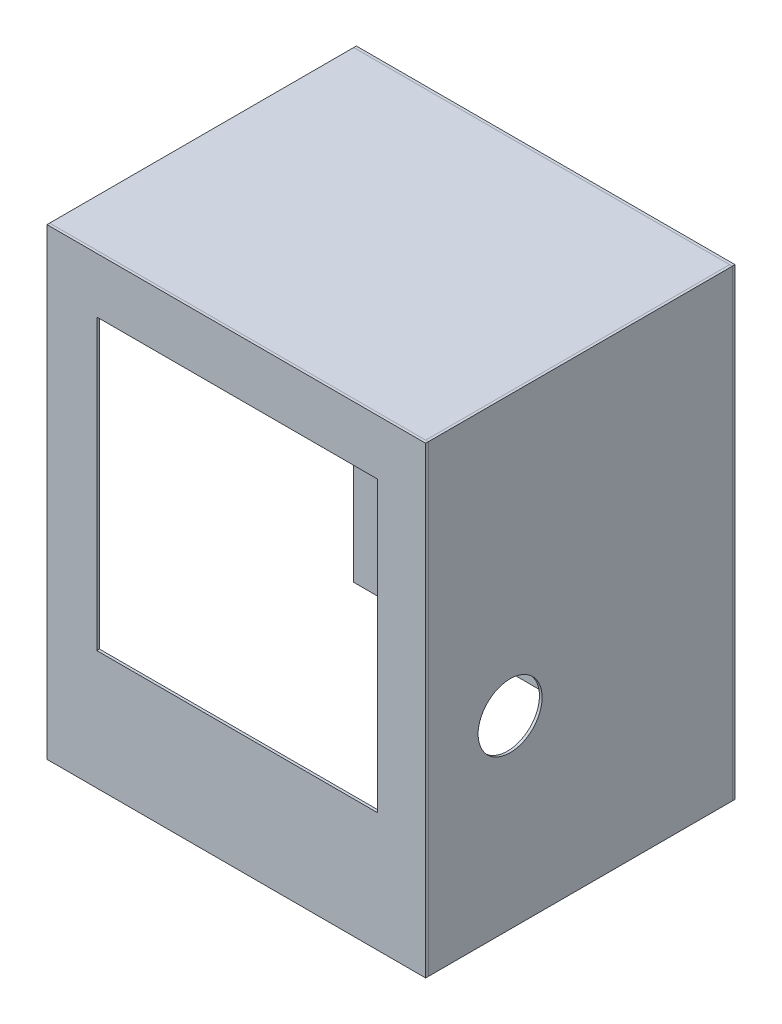
ISO-10303-21;
HEADER;
FILE_DESCRIPTION(('STEP AP214'),'2;1');
FILE_NAME('part.step','',(''),(''),'','','');
FILE_SCHEMA(('AUTOMOTIVE_DESIGN { 1 0 10303 214 1 1 1 1 }'));
ENDSEC;
DATA;
#1=APPLICATION_CONTEXT('core data for automotive mechanical design processes');
#2=APPLICATION_PROTOCOL_DEFINITION('international standard','automotive_design',2000,#1);
#3=PRODUCT_CONTEXT('',#1,'mechanical');
#4=PRODUCT('Part','Part','',(#3));
#5=PRODUCT_RELATED_PRODUCT_CATEGORY('part','',(#4));
#6=PRODUCT_DEFINITION_FORMATION('','',#4);
#7=PRODUCT_DEFINITION_CONTEXT('part definition',#1,'design');
#8=PRODUCT_DEFINITION('design','',#6,#7);
#9=PRODUCT_DEFINITION_SHAPE('','',#8);
#10=(LENGTH_UNIT() NAMED_UNIT(*) SI_UNIT(.MILLI.,.METRE.));
#11=(NAMED_UNIT(*) PLANE_ANGLE_UNIT() SI_UNIT($,.RADIAN.));
#12=(NAMED_UNIT(*) SI_UNIT($,.STERADIAN.) SOLID_ANGLE_UNIT());
#13=UNCERTAINTY_MEASURE_WITH_UNIT(LENGTH_MEASURE(1.E-05),#10,'distance_accuracy_value','');
#14=(GEOMETRIC_REPRESENTATION_CONTEXT(3) GLOBAL_UNCERTAINTY_ASSIGNED_CONTEXT((#13)) GLOBAL_UNIT_ASSIGNED_CONTEXT((#10,
#11,#12)) REPRESENTATION_CONTEXT('',''));
#15=CARTESIAN_POINT('',(0.,0.,0.));
#16=DIRECTION('',(0.,0.,1.));
#17=DIRECTION('',(1.,0.,0.));
#18=AXIS2_PLACEMENT_3D('',#15,#16,#17);
#19=CARTESIAN_POINT('',(671.5125,822.325,-542.925));
#20=DIRECTION('',(1.,0.,0.));
#21=DIRECTION('',(0.,0.,-1.));
#22=AXIS2_PLACEMENT_3D('',#19,#20,#21);
#23=PLANE('',#22);
#24=DIRECTION('',(0.,0.,-1.));
#25=VECTOR('',#24,1.);
#26=CARTESIAN_POINT('',(671.5125,827.0875,-542.925));
#27=LINE('',#26,#25);
#28=CARTESIAN_POINT('',(671.5125,827.0875,0.));
#29=VERTEX_POINT('',#28);
#30=CARTESIAN_POINT('',(671.5125,827.0875,-542.925));
#31=VERTEX_POINT('',#30);
#32=EDGE_CURVE('E109',#29,#31,#27,.T.);
#33=ORIENTED_EDGE('',*,*,#32,.F.);
#34=DIRECTION('',(0.,1.,0.));
#35=VECTOR('',#34,1.);
#36=CARTESIAN_POINT('',(671.5125,822.325,0.));
#37=LINE('',#36,#35);
#38=CARTESIAN_POINT('',(671.5125,822.325,0.));
#39=VERTEX_POINT('',#38);
#40=EDGE_CURVE('E12',#39,#29,#37,.T.);
#41=ORIENTED_EDGE('',*,*,#40,.F.);
#42=DIRECTION('',(0.,0.,-1.));
#43=VECTOR('',#42,1.);
#44=CARTESIAN_POINT('',(671.5125,822.325,-542.925));
#45=LINE('',#44,#43);
#46=CARTESIAN_POINT('',(671.5125,822.325,-542.925));
#47=VERTEX_POINT('',#46);
#48=EDGE_CURVE('E103',#39,#47,#45,.T.);
#49=ORIENTED_EDGE('',*,*,#48,.T.);
#50=DIRECTION('',(0.,1.,0.));
#51=VECTOR('',#50,1.);
#52=CARTESIAN_POINT('',(671.5125,822.325,-542.925));
#53=LINE('',#52,#51);
#54=EDGE_CURVE('E48',#47,#31,#53,.T.);
#55=ORIENTED_EDGE('',*,*,#54,.T.);
#56=EDGE_LOOP('',(#33,#41,#49,#55));
#57=FACE_BOUND('',#56,.T.);
#58=ADVANCED_FACE('F45',(#57),#23,.T.);
#59=CARTESIAN_POINT('',(671.5125,822.325,0.));
#60=DIRECTION('',(0.,0.,1.));
#61=DIRECTION('',(1.,0.,0.));
#62=AXIS2_PLACEMENT_3D('',#59,#60,#61);
#63=PLANE('',#62);
#64=DIRECTION('',(1.,0.,0.));
#65=VECTOR('',#64,1.);
#66=CARTESIAN_POINT('',(671.5125,827.0875,0.));
#67=LINE('',#66,#65);
#68=CARTESIAN_POINT('',(0.,827.0875,0.));
#69=VERTEX_POINT('',#68);
#70=EDGE_CURVE('E105',#69,#29,#67,.T.);
#71=ORIENTED_EDGE('',*,*,#70,.F.);
#72=DIRECTION('',(0.,1.,0.));
#73=VECTOR('',#72,1.);
#74=CARTESIAN_POINT('',(0.,822.325,0.));
#75=LINE('',#74,#73);
#76=CARTESIAN_POINT('',(0.,822.325,0.));
#77=VERTEX_POINT('',#76);
#78=EDGE_CURVE('E54',#77,#69,#75,.T.);
#79=ORIENTED_EDGE('',*,*,#78,.F.);
#80=DIRECTION('',(1.,0.,0.));
#81=VECTOR('',#80,1.);
#82=CARTESIAN_POINT('',(671.5125,822.325,0.));
#83=LINE('',#82,#81);
#84=EDGE_CURVE('E100',#77,#39,#83,.T.);
#85=ORIENTED_EDGE('',*,*,#84,.T.);
#86=ORIENTED_EDGE('',*,*,#40,.T.);
#87=EDGE_LOOP('',(#71,#79,#85,#86));
#88=FACE_BOUND('',#87,.T.);
#89=ADVANCED_FACE('F119',(#88),#63,.T.);
#90=CARTESIAN_POINT('',(0.,822.325,-542.925));
#91=DIRECTION('',(-1.,0.,0.));
#92=DIRECTION('',(0.,0.,1.));
#93=AXIS2_PLACEMENT_3D('',#90,#91,#92);
#94=PLANE('',#93);
#95=DIRECTION('',(0.,0.,1.));
#96=VECTOR('',#95,1.);
#97=CARTESIAN_POINT('',(0.,827.0875,-542.925));
#98=LINE('',#97,#96);
#99=CARTESIAN_POINT('',(0.,827.0875,-542.925));
#100=VERTEX_POINT('',#99);
#101=EDGE_CURVE('E95',#100,#69,#98,.T.);
#102=ORIENTED_EDGE('',*,*,#101,.F.);
#103=DIRECTION('',(0.,1.,0.));
#104=VECTOR('',#103,1.);
#105=CARTESIAN_POINT('',(0.,822.325,-542.925));
#106=LINE('',#105,#104);
#107=CARTESIAN_POINT('',(0.,822.325,-542.925));
#108=VERTEX_POINT('',#107);
#109=EDGE_CURVE('E90',#108,#100,#106,.T.);
#110=ORIENTED_EDGE('',*,*,#109,.F.);
#111=DIRECTION('',(0.,0.,1.));
#112=VECTOR('',#111,1.);
#113=CARTESIAN_POINT('',(0.,822.325,-542.925));
#114=LINE('',#113,#112);
#115=EDGE_CURVE('E93',#108,#77,#114,.T.);
#116=ORIENTED_EDGE('',*,*,#115,.T.);
#117=ORIENTED_EDGE('',*,*,#78,.T.);
#118=EDGE_LOOP('',(#102,#110,#116,#117));
#119=FACE_BOUND('',#118,.T.);
#120=ADVANCED_FACE('F92',(#119),#94,.T.);
#121=CARTESIAN_POINT('',(671.5125,822.325,-542.925));
#122=DIRECTION('',(0.,0.,-1.));
#123=DIRECTION('',(-1.,0.,0.));
#124=AXIS2_PLACEMENT_3D('',#121,#122,#123);
#125=PLANE('',#124);
#126=DIRECTION('',(-1.,0.,0.));
#127=VECTOR('',#126,1.);
#128=CARTESIAN_POINT('',(671.5125,827.0875,-542.925));
#129=LINE('',#128,#127);
#130=EDGE_CURVE('E112',#31,#100,#129,.T.);
#131=ORIENTED_EDGE('',*,*,#130,.F.);
#132=ORIENTED_EDGE('',*,*,#54,.F.);
#133=DIRECTION('',(-1.,0.,0.));
#134=VECTOR('',#133,1.);
#135=CARTESIAN_POINT('',(671.5125,822.325,-542.925));
#136=LINE('',#135,#134);
#137=EDGE_CURVE('E99',#47,#108,#136,.T.);
#138=ORIENTED_EDGE('',*,*,#137,.T.);
#139=ORIENTED_EDGE('',*,*,#109,.T.);
#140=EDGE_LOOP('',(#131,#132,#138,#139));
#141=FACE_BOUND('',#140,.T.);
#142=ADVANCED_FACE('F102',(#141),#125,.T.);
#143=CARTESIAN_POINT('',(0.,822.325,0.));
#144=DIRECTION('',(0.,-1.,0.));
#145=DIRECTION('',(0.,0.,-1.));
#146=AXIS2_PLACEMENT_3D('',#143,#144,#145);
#147=PLANE('',#146);
#148=ORIENTED_EDGE('',*,*,#48,.F.);
#149=ORIENTED_EDGE('',*,*,#84,.F.);
#150=ORIENTED_EDGE('',*,*,#115,.F.);
#151=ORIENTED_EDGE('',*,*,#137,.F.);
#152=EDGE_LOOP('',(#148,#149,#150,#151));
#153=FACE_BOUND('',#152,.T.);
#154=ADVANCED_FACE('F98',(#153),#147,.T.);
#155=CARTESIAN_POINT('',(0.,827.0875,0.));
#156=DIRECTION('',(0.,-1.,0.));
#157=DIRECTION('',(0.,0.,-1.));
#158=AXIS2_PLACEMENT_3D('',#155,#156,#157);
#159=PLANE('',#158);
#160=ORIENTED_EDGE('',*,*,#32,.T.);
#161=ORIENTED_EDGE('',*,*,#130,.T.);
#162=ORIENTED_EDGE('',*,*,#101,.T.);
#163=ORIENTED_EDGE('',*,*,#70,.T.);
#164=EDGE_LOOP('',(#160,#161,#162,#163));
#165=FACE_BOUND('',#164,.T.);
#166=ADVANCED_FACE('F118',(#165),#159,.F.);
#167=CLOSED_SHELL('',(#58,#89,#120,#142,#154,#166));
#168=MANIFOLD_SOLID_BREP('B2',#167);
#169=CARTESIAN_POINT('',(676.275,827.0875,-547.6875));
#170=DIRECTION('',(-1.,0.,0.));
#171=DIRECTION('',(0.,0.,1.));
#172=AXIS2_PLACEMENT_3D('',#169,#170,#171);
#173=PLANE('',#172);
#174=DIRECTION('',(0.,-1.,0.));
#175=VECTOR('',#174,1.);
#176=CARTESIAN_POINT('',(676.275,827.0875,-542.925));
#177=LINE('',#176,#175);
#178=CARTESIAN_POINT('',(676.275,827.0875,-542.925));
#179=VERTEX_POINT('',#178);
#180=CARTESIAN_POINT('',(676.275,0.,-542.925));
#181=VERTEX_POINT('',#180);
#182=EDGE_CURVE('E241',#179,#181,#177,.T.);
#183=ORIENTED_EDGE('',*,*,#182,.T.);
#184=DIRECTION('',(0.,0.,1.));
#185=VECTOR('',#184,1.);
#186=CARTESIAN_POINT('',(676.275,0.,-547.6875));
#187=LINE('',#186,#185);
#188=CARTESIAN_POINT('',(676.275,0.,-547.6875));
#189=VERTEX_POINT('',#188);
#190=EDGE_CURVE('E43',#189,#181,#187,.T.);
#191=ORIENTED_EDGE('',*,*,#190,.F.);
#192=DIRECTION('',(0.,-1.,0.));
#193=VECTOR('',#192,1.);
#194=CARTESIAN_POINT('',(676.275,827.0875,-547.6875));
#195=LINE('',#194,#193);
#196=CARTESIAN_POINT('',(676.275,827.0875,-547.6875));
#197=VERTEX_POINT('',#196);
#198=EDGE_CURVE('E229',#197,#189,#195,.T.);
#199=ORIENTED_EDGE('',*,*,#198,.F.);
#200=DIRECTION('',(0.,0.,1.));
#201=VECTOR('',#200,1.);
#202=CARTESIAN_POINT('',(676.275,827.0875,-547.6875));
#203=LINE('',#202,#201);
#204=EDGE_CURVE('E237',#197,#179,#203,.T.);
#205=ORIENTED_EDGE('',*,*,#204,.T.);
#206=EDGE_LOOP('',(#183,#191,#199,#205));
#207=FACE_BOUND('',#206,.T.);
#208=ADVANCED_FACE('F178',(#207),#173,.F.);
#209=CARTESIAN_POINT('',(676.275,0.,-547.6875));
#210=DIRECTION('',(0.,1.,0.));
#211=DIRECTION('',(0.,0.,1.));
#212=AXIS2_PLACEMENT_3D('',#209,#210,#211);
#213=PLANE('',#212);
#214=DIRECTION('',(-1.,0.,0.));
#215=VECTOR('',#214,1.);
#216=CARTESIAN_POINT('',(676.275,0.,-542.925));
#217=LINE('',#216,#215);
#218=CARTESIAN_POINT('',(-1.11022302462516E-13,0.,-542.925));
#219=VERTEX_POINT('',#218);
#220=EDGE_CURVE('E233',#181,#219,#217,.T.);
#221=ORIENTED_EDGE('',*,*,#220,.T.);
#222=DIRECTION('',(0.,0.,1.));
#223=VECTOR('',#222,1.);
#224=CARTESIAN_POINT('',(-1.11022302462516E-13,0.,-547.6875));
#225=LINE('',#224,#223);
#226=CARTESIAN_POINT('',(-1.11022302462516E-13,0.,-547.6875));
#227=VERTEX_POINT('',#226);
#228=EDGE_CURVE('E186',#227,#219,#225,.T.);
#229=ORIENTED_EDGE('',*,*,#228,.F.);
#230=DIRECTION('',(-1.,0.,0.));
#231=VECTOR('',#230,1.);
#232=CARTESIAN_POINT('',(676.275,0.,-547.6875));
#233=LINE('',#232,#231);
#234=EDGE_CURVE('E224',#189,#227,#233,.T.);
#235=ORIENTED_EDGE('',*,*,#234,.F.);
#236=ORIENTED_EDGE('',*,*,#190,.T.);
#237=EDGE_LOOP('',(#221,#229,#235,#236));
#238=FACE_BOUND('',#237,.T.);
#239=ADVANCED_FACE('F232',(#238),#213,.F.);
#240=CARTESIAN_POINT('',(0.,827.0875,-547.6875));
#241=DIRECTION('',(1.,0.,0.));
#242=DIRECTION('',(0.,1.,0.));
#243=AXIS2_PLACEMENT_3D('',#240,#241,#242);
#244=PLANE('',#243);
#245=DIRECTION('',(0.,1.,0.));
#246=VECTOR('',#245,1.);
#247=CARTESIAN_POINT('',(0.,827.0875,-542.925));
#248=LINE('',#247,#246);
#249=CARTESIAN_POINT('',(0.,827.0875,-542.925));
#250=VERTEX_POINT('',#249);
#251=EDGE_CURVE('E211',#219,#250,#248,.T.);
#252=ORIENTED_EDGE('',*,*,#251,.T.);
#253=DIRECTION('',(0.,0.,1.));
#254=VECTOR('',#253,1.);
#255=CARTESIAN_POINT('',(0.,827.0875,-547.6875));
#256=LINE('',#255,#254);
#257=CARTESIAN_POINT('',(0.,827.0875,-547.6875));
#258=VERTEX_POINT('',#257);
#259=EDGE_CURVE('E234',#258,#250,#256,.T.);
#260=ORIENTED_EDGE('',*,*,#259,.F.);
#261=DIRECTION('',(0.,1.,0.));
#262=VECTOR('',#261,1.);
#263=CARTESIAN_POINT('',(0.,827.0875,-547.6875));
#264=LINE('',#263,#262);
#265=EDGE_CURVE('E227',#227,#258,#264,.T.);
#266=ORIENTED_EDGE('',*,*,#265,.F.);
#267=ORIENTED_EDGE('',*,*,#228,.T.);
#268=EDGE_LOOP('',(#252,#260,#266,#267));
#269=FACE_BOUND('',#268,.T.);
#270=ADVANCED_FACE('F235',(#269),#244,.F.);
#271=CARTESIAN_POINT('',(676.275,827.0875,-547.6875));
#272=DIRECTION('',(0.,-1.,0.));
#273=DIRECTION('',(0.,0.,-1.));
#274=AXIS2_PLACEMENT_3D('',#271,#272,#273);
#275=PLANE('',#274);
#276=DIRECTION('',(1.,0.,0.));
#277=VECTOR('',#276,1.);
#278=CARTESIAN_POINT('',(676.275,827.0875,-542.925));
#279=LINE('',#278,#277);
#280=EDGE_CURVE('E217',#250,#179,#279,.T.);
#281=ORIENTED_EDGE('',*,*,#280,.T.);
#282=ORIENTED_EDGE('',*,*,#204,.F.);
#283=DIRECTION('',(1.,0.,0.));
#284=VECTOR('',#283,1.);
#285=CARTESIAN_POINT('',(676.275,827.0875,-547.6875));
#286=LINE('',#285,#284);
#287=EDGE_CURVE('E194',#258,#197,#286,.T.);
#288=ORIENTED_EDGE('',*,*,#287,.F.);
#289=ORIENTED_EDGE('',*,*,#259,.T.);
#290=EDGE_LOOP('',(#281,#282,#288,#289));
#291=FACE_BOUND('',#290,.T.);
#292=ADVANCED_FACE('F248',(#291),#275,.F.);
#293=CARTESIAN_POINT('',(0.,0.,-547.6875));
#294=DIRECTION('',(0.,0.,-1.));
#295=DIRECTION('',(-1.,0.,0.));
#296=AXIS2_PLACEMENT_3D('',#293,#294,#295);
#297=PLANE('',#296);
#298=ORIENTED_EDGE('',*,*,#198,.T.);
#299=ORIENTED_EDGE('',*,*,#234,.T.);
#300=ORIENTED_EDGE('',*,*,#265,.T.);
#301=ORIENTED_EDGE('',*,*,#287,.T.);
#302=EDGE_LOOP('',(#298,#299,#300,#301));
#303=FACE_BOUND('',#302,.T.);
#304=ADVANCED_FACE('F225',(#303),#297,.T.);
#305=CARTESIAN_POINT('',(0.,0.,-542.925));
#306=DIRECTION('',(0.,0.,-1.));
#307=DIRECTION('',(-1.,0.,0.));
#308=AXIS2_PLACEMENT_3D('',#305,#306,#307);
#309=PLANE('',#308);
#310=ORIENTED_EDGE('',*,*,#182,.F.);
#311=ORIENTED_EDGE('',*,*,#280,.F.);
#312=ORIENTED_EDGE('',*,*,#251,.F.);
#313=ORIENTED_EDGE('',*,*,#220,.F.);
#314=EDGE_LOOP('',(#310,#311,#312,#313));
#315=FACE_BOUND('',#314,.T.);
#316=ADVANCED_FACE('F251',(#315),#309,.F.);
#317=CLOSED_SHELL('',(#208,#239,#270,#292,#304,#316));
#318=MANIFOLD_SOLID_BREP('B6',#317);
#319=CARTESIAN_POINT('',(676.275,827.0875,-542.925));
#320=DIRECTION('',(-1.,0.,0.));
#321=DIRECTION('',(0.,-1.,0.));
#322=AXIS2_PLACEMENT_3D('',#319,#320,#321);
#323=PLANE('',#322);
#324=CARTESIAN_POINT('',(676.275,330.2,-146.05));
#325=DIRECTION('',(1.,0.,0.));
#326=DIRECTION('',(0.,1.,0.));
#327=AXIS2_PLACEMENT_3D('',#324,#325,#326);
#328=CIRCLE('',#327,57.15);
#329=CARTESIAN_POINT('',(676.275,387.35,-146.05));
#330=VERTEX_POINT('',#329);
#331=EDGE_CURVE('E388',#330,#330,#328,.T.);
#332=ORIENTED_EDGE('',*,*,#331,.F.);
#333=EDGE_LOOP('',(#332));
#334=FACE_BOUND('',#333,.T.);
#335=DIRECTION('',(0.,-1.,0.));
#336=VECTOR('',#335,1.);
#337=CARTESIAN_POINT('',(676.275,827.0875,0.));
#338=LINE('',#337,#336);
#339=CARTESIAN_POINT('',(676.275,827.0875,0.));
#340=VERTEX_POINT('',#339);
#341=CARTESIAN_POINT('',(676.275,0.,0.));
#342=VERTEX_POINT('',#341);
#343=EDGE_CURVE('E375',#340,#342,#338,.T.);
#344=ORIENTED_EDGE('',*,*,#343,.T.);
#345=DIRECTION('',(0.,0.,1.));
#346=VECTOR('',#345,1.);
#347=CARTESIAN_POINT('',(676.275,0.,-542.925));
#348=LINE('',#347,#346);
#349=CARTESIAN_POINT('',(676.275,0.,-542.925));
#350=VERTEX_POINT('',#349);
#351=EDGE_CURVE('E176',#350,#342,#348,.T.);
#352=ORIENTED_EDGE('',*,*,#351,.F.);
#353=DIRECTION('',(0.,-1.,0.));
#354=VECTOR('',#353,1.);
#355=CARTESIAN_POINT('',(676.275,827.0875,-542.925));
#356=LINE('',#355,#354);
#357=CARTESIAN_POINT('',(676.275,827.0875,-542.925));
#358=VERTEX_POINT('',#357);
#359=EDGE_CURVE('E362',#358,#350,#356,.T.);
#360=ORIENTED_EDGE('',*,*,#359,.F.);
#361=DIRECTION('',(0.,0.,1.));
#362=VECTOR('',#361,1.);
#363=CARTESIAN_POINT('',(676.275,827.0875,-542.925));
#364=LINE('',#363,#362);
#365=EDGE_CURVE('E371',#358,#340,#364,.T.);
#366=ORIENTED_EDGE('',*,*,#365,.T.);
#367=EDGE_LOOP('',(#344,#352,#360,#366));
#368=FACE_BOUND('',#367,.T.);
#369=ADVANCED_FACE('F310',(#334,#368),#323,.F.);
#370=CARTESIAN_POINT('',(676.275,0.,-542.925));
#371=DIRECTION('',(0.,1.,0.));
#372=DIRECTION('',(0.,0.,1.));
#373=AXIS2_PLACEMENT_3D('',#370,#371,#372);
#374=PLANE('',#373);
#375=DIRECTION('',(-1.,0.,0.));
#376=VECTOR('',#375,1.);
#377=CARTESIAN_POINT('',(676.275,0.,0.));
#378=LINE('',#377,#376);
#379=CARTESIAN_POINT('',(671.5125,0.,0.));
#380=VERTEX_POINT('',#379);
#381=EDGE_CURVE('E366',#342,#380,#378,.T.);
#382=ORIENTED_EDGE('',*,*,#381,.T.);
#383=DIRECTION('',(0.,0.,1.));
#384=VECTOR('',#383,1.);
#385=CARTESIAN_POINT('',(671.5125,0.,-542.925));
#386=LINE('',#385,#384);
#387=CARTESIAN_POINT('',(671.5125,0.,-542.925));
#388=VERTEX_POINT('',#387);
#389=EDGE_CURVE('E319',#388,#380,#386,.T.);
#390=ORIENTED_EDGE('',*,*,#389,.F.);
#391=DIRECTION('',(-1.,0.,0.));
#392=VECTOR('',#391,1.);
#393=CARTESIAN_POINT('',(676.275,0.,-542.925));
#394=LINE('',#393,#392);
#395=EDGE_CURVE('E357',#350,#388,#394,.T.);
#396=ORIENTED_EDGE('',*,*,#395,.F.);
#397=ORIENTED_EDGE('',*,*,#351,.T.);
#398=EDGE_LOOP('',(#382,#390,#396,#397));
#399=FACE_BOUND('',#398,.T.);
#400=ADVANCED_FACE('F365',(#399),#374,.F.);
#401=CARTESIAN_POINT('',(671.5125,827.0875,-542.925));
#402=DIRECTION('',(1.,0.,0.));
#403=DIRECTION('',(0.,1.,0.));
#404=AXIS2_PLACEMENT_3D('',#401,#402,#403);
#405=PLANE('',#404);
#406=CARTESIAN_POINT('',(671.5125,330.2,-146.05));
#407=DIRECTION('',(1.,0.,0.));
#408=DIRECTION('',(0.,1.,0.));
#409=AXIS2_PLACEMENT_3D('',#406,#407,#408);
#410=CIRCLE('',#409,57.15);
#411=CARTESIAN_POINT('',(671.5125,387.35,-146.05));
#412=VERTEX_POINT('',#411);
#413=EDGE_CURVE('E313',#412,#412,#410,.T.);
#414=ORIENTED_EDGE('',*,*,#413,.T.);
#415=EDGE_LOOP('',(#414));
#416=FACE_BOUND('',#415,.T.);
#417=DIRECTION('',(0.,1.,0.));
#418=VECTOR('',#417,1.);
#419=CARTESIAN_POINT('',(671.5125,827.0875,0.));
#420=LINE('',#419,#418);
#421=CARTESIAN_POINT('',(671.5125,827.0875,0.));
#422=VERTEX_POINT('',#421);
#423=EDGE_CURVE('E344',#380,#422,#420,.T.);
#424=ORIENTED_EDGE('',*,*,#423,.T.);
#425=DIRECTION('',(0.,0.,1.));
#426=VECTOR('',#425,1.);
#427=CARTESIAN_POINT('',(671.5125,827.0875,-542.925));
#428=LINE('',#427,#426);
#429=CARTESIAN_POINT('',(671.5125,827.0875,-542.925));
#430=VERTEX_POINT('',#429);
#431=EDGE_CURVE('E367',#430,#422,#428,.T.);
#432=ORIENTED_EDGE('',*,*,#431,.F.);
#433=DIRECTION('',(0.,1.,0.));
#434=VECTOR('',#433,1.);
#435=CARTESIAN_POINT('',(671.5125,827.0875,-542.925));
#436=LINE('',#435,#434);
#437=EDGE_CURVE('E360',#388,#430,#436,.T.);
#438=ORIENTED_EDGE('',*,*,#437,.F.);
#439=ORIENTED_EDGE('',*,*,#389,.T.);
#440=EDGE_LOOP('',(#424,#432,#438,#439));
#441=FACE_BOUND('',#440,.T.);
#442=ADVANCED_FACE('F369',(#416,#441),#405,.F.);
#443=CARTESIAN_POINT('',(676.275,827.0875,-542.925));
#444=DIRECTION('',(0.,-1.,0.));
#445=DIRECTION('',(0.,0.,-1.));
#446=AXIS2_PLACEMENT_3D('',#443,#444,#445);
#447=PLANE('',#446);
#448=DIRECTION('',(1.,0.,0.));
#449=VECTOR('',#448,1.);
#450=CARTESIAN_POINT('',(676.275,827.0875,0.));
#451=LINE('',#450,#449);
#452=EDGE_CURVE('E350',#422,#340,#451,.T.);
#453=ORIENTED_EDGE('',*,*,#452,.T.);
#454=ORIENTED_EDGE('',*,*,#365,.F.);
#455=DIRECTION('',(1.,0.,0.));
#456=VECTOR('',#455,1.);
#457=CARTESIAN_POINT('',(676.275,827.0875,-542.925));
#458=LINE('',#457,#456);
#459=EDGE_CURVE('E327',#430,#358,#458,.T.);
#460=ORIENTED_EDGE('',*,*,#459,.F.);
#461=ORIENTED_EDGE('',*,*,#431,.T.);
#462=EDGE_LOOP('',(#453,#454,#460,#461));
#463=FACE_BOUND('',#462,.T.);
#464=ADVANCED_FACE('F382',(#463),#447,.F.);
#465=CARTESIAN_POINT('',(0.,0.,-542.925));
#466=DIRECTION('',(0.,0.,-1.));
#467=DIRECTION('',(-1.,0.,0.));
#468=AXIS2_PLACEMENT_3D('',#465,#466,#467);
#469=PLANE('',#468);
#470=ORIENTED_EDGE('',*,*,#359,.T.);
#471=ORIENTED_EDGE('',*,*,#395,.T.);
#472=ORIENTED_EDGE('',*,*,#437,.T.);
#473=ORIENTED_EDGE('',*,*,#459,.T.);
#474=EDGE_LOOP('',(#470,#471,#472,#473));
#475=FACE_BOUND('',#474,.T.);
#476=ADVANCED_FACE('F358',(#475),#469,.T.);
#477=CARTESIAN_POINT('',(0.,0.,0.));
#478=DIRECTION('',(0.,0.,-1.));
#479=DIRECTION('',(-1.,0.,0.));
#480=AXIS2_PLACEMENT_3D('',#477,#478,#479);
#481=PLANE('',#480);
#482=ORIENTED_EDGE('',*,*,#343,.F.);
#483=ORIENTED_EDGE('',*,*,#452,.F.);
#484=ORIENTED_EDGE('',*,*,#423,.F.);
#485=ORIENTED_EDGE('',*,*,#381,.F.);
#486=EDGE_LOOP('',(#482,#483,#484,#485));
#487=FACE_BOUND('',#486,.T.);
#488=ADVANCED_FACE('F385',(#487),#481,.F.);
#489=CARTESIAN_POINT('',(-2.22044604925031E-13,330.2,-146.05));
#490=DIRECTION('',(1.,0.,0.));
#491=DIRECTION('',(0.,1.,0.));
#492=AXIS2_PLACEMENT_3D('',#489,#490,#491);
#493=CYLINDRICAL_SURFACE('',#492,57.15);
#494=ORIENTED_EDGE('',*,*,#331,.T.);
#495=EDGE_LOOP('',(#494));
#496=FACE_BOUND('',#495,.T.);
#497=ORIENTED_EDGE('',*,*,#413,.F.);
#498=EDGE_LOOP('',(#497));
#499=FACE_BOUND('',#498,.T.);
#500=ADVANCED_FACE('F396',(#496,#499),#493,.F.);
#501=CLOSED_SHELL('',(#369,#400,#442,#464,#476,#488,#500));
#502=MANIFOLD_SOLID_BREP('B37',#501);
#503=CARTESIAN_POINT('',(0.,0.,4.7625));
#504=DIRECTION('',(1.,0.,0.));
#505=DIRECTION('',(0.,0.,-1.));
#506=AXIS2_PLACEMENT_3D('',#503,#504,#505);
#507=PLANE('',#506);
#508=DIRECTION('',(0.,-1.,0.));
#509=VECTOR('',#508,1.);
#510=CARTESIAN_POINT('',(0.,0.,0.));
#511=LINE('',#510,#509);
#512=CARTESIAN_POINT('',(0.,827.0875,0.));
#513=VERTEX_POINT('',#512);
#514=CARTESIAN_POINT('',(0.,0.,0.));
#515=VERTEX_POINT('',#514);
#516=EDGE_CURVE('E524',#513,#515,#511,.T.);
#517=ORIENTED_EDGE('',*,*,#516,.T.);
#518=DIRECTION('',(0.,0.,-1.));
#519=VECTOR('',#518,1.);
#520=CARTESIAN_POINT('',(0.,0.,4.7625));
#521=LINE('',#520,#519);
#522=CARTESIAN_POINT('',(0.,0.,4.7625));
#523=VERTEX_POINT('',#522);
#524=EDGE_CURVE('E308',#523,#515,#521,.T.);
#525=ORIENTED_EDGE('',*,*,#524,.F.);
#526=DIRECTION('',(0.,-1.,0.));
#527=VECTOR('',#526,1.);
#528=CARTESIAN_POINT('',(0.,0.,4.7625));
#529=LINE('',#528,#527);
#530=CARTESIAN_POINT('',(0.,827.0875,4.7625));
#531=VERTEX_POINT('',#530);
#532=EDGE_CURVE('E553',#531,#523,#529,.T.);
#533=ORIENTED_EDGE('',*,*,#532,.F.);
#534=DIRECTION('',(0.,0.,-1.));
#535=VECTOR('',#534,1.);
#536=CARTESIAN_POINT('',(0.,827.0875,4.7625));
#537=LINE('',#536,#535);
#538=EDGE_CURVE('E563',#531,#513,#537,.T.);
#539=ORIENTED_EDGE('',*,*,#538,.T.);
#540=EDGE_LOOP('',(#517,#525,#533,#539));
#541=FACE_BOUND('',#540,.T.);
#542=ADVANCED_FACE('F454',(#541),#507,.F.);
#543=CARTESIAN_POINT('',(0.,0.,4.7625));
#544=DIRECTION('',(0.,1.,0.));
#545=DIRECTION('',(0.,0.,1.));
#546=AXIS2_PLACEMENT_3D('',#543,#544,#545);
#547=PLANE('',#546);
#548=DIRECTION('',(1.,0.,0.));
#549=VECTOR('',#548,1.);
#550=CARTESIAN_POINT('',(0.,0.,0.));
#551=LINE('',#550,#549);
#552=CARTESIAN_POINT('',(676.275,0.,0.));
#553=VERTEX_POINT('',#552);
#554=EDGE_CURVE('E566',#515,#553,#551,.T.);
#555=ORIENTED_EDGE('',*,*,#554,.T.);
#556=DIRECTION('',(0.,0.,-1.));
#557=VECTOR('',#556,1.);
#558=CARTESIAN_POINT('',(676.275,0.,4.7625));
#559=LINE('',#558,#557);
#560=CARTESIAN_POINT('',(676.275,0.,4.7625));
#561=VERTEX_POINT('',#560);
#562=EDGE_CURVE('E461',#561,#553,#559,.T.);
#563=ORIENTED_EDGE('',*,*,#562,.F.);
#564=DIRECTION('',(1.,0.,0.));
#565=VECTOR('',#564,1.);
#566=CARTESIAN_POINT('',(0.,0.,4.7625));
#567=LINE('',#566,#565);
#568=EDGE_CURVE('E556',#523,#561,#567,.T.);
#569=ORIENTED_EDGE('',*,*,#568,.F.);
#570=ORIENTED_EDGE('',*,*,#524,.T.);
#571=EDGE_LOOP('',(#555,#563,#569,#570));
#572=FACE_BOUND('',#571,.T.);
#573=ADVANCED_FACE('F594',(#572),#547,.F.);
#574=CARTESIAN_POINT('',(676.275,0.,4.7625));
#575=DIRECTION('',(-1.,0.,0.));
#576=DIRECTION('',(0.,0.,1.));
#577=AXIS2_PLACEMENT_3D('',#574,#575,#576);
#578=PLANE('',#577);
#579=DIRECTION('',(0.,1.,0.));
#580=VECTOR('',#579,1.);
#581=CARTESIAN_POINT('',(676.275,0.,0.));
#582=LINE('',#581,#580);
#583=CARTESIAN_POINT('',(676.275,827.0875,0.));
#584=VERTEX_POINT('',#583);
#585=EDGE_CURVE('E568',#553,#584,#582,.T.);
#586=ORIENTED_EDGE('',*,*,#585,.T.);
#587=DIRECTION('',(0.,0.,-1.));
#588=VECTOR('',#587,1.);
#589=CARTESIAN_POINT('',(676.275,827.0875,4.7625));
#590=LINE('',#589,#588);
#591=CARTESIAN_POINT('',(676.275,827.0875,4.7625));
#592=VERTEX_POINT('',#591);
#593=EDGE_CURVE('E573',#592,#584,#590,.T.);
#594=ORIENTED_EDGE('',*,*,#593,.F.);
#595=DIRECTION('',(0.,1.,0.));
#596=VECTOR('',#595,1.);
#597=CARTESIAN_POINT('',(676.275,0.,4.7625));
#598=LINE('',#597,#596);
#599=EDGE_CURVE('E559',#561,#592,#598,.T.);
#600=ORIENTED_EDGE('',*,*,#599,.F.);
#601=ORIENTED_EDGE('',*,*,#562,.T.);
#602=EDGE_LOOP('',(#586,#594,#600,#601));
#603=FACE_BOUND('',#602,.T.);
#604=ADVANCED_FACE('F580',(#603),#578,.F.);
#605=CARTESIAN_POINT('',(0.,827.0875,4.7625));
#606=DIRECTION('',(0.,-1.,0.));
#607=DIRECTION('',(0.,0.,-1.));
#608=AXIS2_PLACEMENT_3D('',#605,#606,#607);
#609=PLANE('',#608);
#610=DIRECTION('',(-1.,0.,0.));
#611=VECTOR('',#610,1.);
#612=CARTESIAN_POINT('',(0.,827.0875,0.));
#613=LINE('',#612,#611);
#614=EDGE_CURVE('E557',#584,#513,#613,.T.);
#615=ORIENTED_EDGE('',*,*,#614,.T.);
#616=ORIENTED_EDGE('',*,*,#538,.F.);
#617=DIRECTION('',(-1.,0.,0.));
#618=VECTOR('',#617,1.);
#619=CARTESIAN_POINT('',(0.,827.0875,4.7625));
#620=LINE('',#619,#618);
#621=EDGE_CURVE('E561',#592,#531,#620,.T.);
#622=ORIENTED_EDGE('',*,*,#621,.F.);
#623=ORIENTED_EDGE('',*,*,#593,.T.);
#624=EDGE_LOOP('',(#615,#616,#622,#623));
#625=FACE_BOUND('',#624,.T.);
#626=ADVANCED_FACE('F587',(#625),#609,.F.);
#627=CARTESIAN_POINT('',(0.,0.,4.7625));
#628=DIRECTION('',(0.,0.,-1.));
#629=DIRECTION('',(-1.,0.,0.));
#630=AXIS2_PLACEMENT_3D('',#627,#628,#629);
#631=PLANE('',#630);
#632=DIRECTION('',(-1.,0.,0.));
#633=VECTOR('',#632,1.);
#634=CARTESIAN_POINT('',(88.9,728.6625,4.7625));
#635=LINE('',#634,#633);
#636=CARTESIAN_POINT('',(590.55,728.6625,4.7625));
#637=VERTEX_POINT('',#636);
#638=CARTESIAN_POINT('',(88.9,728.6625,4.7625));
#639=VERTEX_POINT('',#638);
#640=EDGE_CURVE('E537',#637,#639,#635,.T.);
#641=ORIENTED_EDGE('',*,*,#640,.F.);
#642=DIRECTION('',(0.,1.,0.));
#643=VECTOR('',#642,1.);
#644=CARTESIAN_POINT('',(590.55,728.6625,4.7625));
#645=LINE('',#644,#643);
#646=CARTESIAN_POINT('',(590.55,212.725,4.7625));
#647=VERTEX_POINT('',#646);
#648=EDGE_CURVE('E468',#647,#637,#645,.T.);
#649=ORIENTED_EDGE('',*,*,#648,.F.);
#650=DIRECTION('',(1.,0.,0.));
#651=VECTOR('',#650,1.);
#652=CARTESIAN_POINT('',(88.9000000000001,212.725,4.7625));
#653=LINE('',#652,#651);
#654=CARTESIAN_POINT('',(88.9000000000001,212.725,4.7625));
#655=VERTEX_POINT('',#654);
#656=EDGE_CURVE('E530',#655,#647,#653,.T.);
#657=ORIENTED_EDGE('',*,*,#656,.F.);
#658=DIRECTION('',(0.,-1.,0.));
#659=VECTOR('',#658,1.);
#660=CARTESIAN_POINT('',(88.9,728.6625,4.7625));
#661=LINE('',#660,#659);
#662=EDGE_CURVE('E544',#639,#655,#661,.T.);
#663=ORIENTED_EDGE('',*,*,#662,.F.);
#664=EDGE_LOOP('',(#641,#649,#657,#663));
#665=FACE_BOUND('',#664,.T.);
#666=ORIENTED_EDGE('',*,*,#532,.T.);
#667=ORIENTED_EDGE('',*,*,#568,.T.);
#668=ORIENTED_EDGE('',*,*,#599,.T.);
#669=ORIENTED_EDGE('',*,*,#621,.T.);
#670=EDGE_LOOP('',(#666,#667,#668,#669));
#671=FACE_BOUND('',#670,.T.);
#672=ADVANCED_FACE('F593',(#665,#671),#631,.F.);
#673=CARTESIAN_POINT('',(0.,0.,0.));
#674=DIRECTION('',(0.,0.,-1.));
#675=DIRECTION('',(-1.,0.,0.));
#676=AXIS2_PLACEMENT_3D('',#673,#674,#675);
#677=PLANE('',#676);
#678=DIRECTION('',(0.,1.,0.));
#679=VECTOR('',#678,1.);
#680=CARTESIAN_POINT('',(590.55,728.6625,0.));
#681=LINE('',#680,#679);
#682=CARTESIAN_POINT('',(590.55,212.725,0.));
#683=VERTEX_POINT('',#682);
#684=CARTESIAN_POINT('',(590.55,728.6625,0.));
#685=VERTEX_POINT('',#684);
#686=EDGE_CURVE('E528',#683,#685,#681,.T.);
#687=ORIENTED_EDGE('',*,*,#686,.T.);
#688=DIRECTION('',(-1.,0.,0.));
#689=VECTOR('',#688,1.);
#690=CARTESIAN_POINT('',(88.9,728.6625,0.));
#691=LINE('',#690,#689);
#692=CARTESIAN_POINT('',(88.9,728.6625,0.));
#693=VERTEX_POINT('',#692);
#694=EDGE_CURVE('E517',#685,#693,#691,.T.);
#695=ORIENTED_EDGE('',*,*,#694,.T.);
#696=DIRECTION('',(0.,-1.,0.));
#697=VECTOR('',#696,1.);
#698=CARTESIAN_POINT('',(88.9,728.6625,0.));
#699=LINE('',#698,#697);
#700=CARTESIAN_POINT('',(88.9000000000001,212.725,0.));
#701=VERTEX_POINT('',#700);
#702=EDGE_CURVE('E539',#693,#701,#699,.T.);
#703=ORIENTED_EDGE('',*,*,#702,.T.);
#704=DIRECTION('',(1.,0.,0.));
#705=VECTOR('',#704,1.);
#706=CARTESIAN_POINT('',(88.9000000000001,212.725,0.));
#707=LINE('',#706,#705);
#708=EDGE_CURVE('E535',#701,#683,#707,.T.);
#709=ORIENTED_EDGE('',*,*,#708,.T.);
#710=EDGE_LOOP('',(#687,#695,#703,#709));
#711=FACE_BOUND('',#710,.T.);
#712=ORIENTED_EDGE('',*,*,#516,.F.);
#713=ORIENTED_EDGE('',*,*,#614,.F.);
#714=ORIENTED_EDGE('',*,*,#585,.F.);
#715=ORIENTED_EDGE('',*,*,#554,.F.);
#716=EDGE_LOOP('',(#712,#713,#714,#715));
#717=FACE_BOUND('',#716,.T.);
#718=ADVANCED_FACE('F533',(#711,#717),#677,.T.);
#719=CARTESIAN_POINT('',(590.55,728.6625,-547.6885));
#720=DIRECTION('',(1.,0.,0.));
#721=DIRECTION('',(0.,1.,0.));
#722=AXIS2_PLACEMENT_3D('',#719,#720,#721);
#723=PLANE('',#722);
#724=DIRECTION('',(0.,0.,1.));
#725=VECTOR('',#724,1.);
#726=CARTESIAN_POINT('',(590.55,212.725,-547.6885));
#727=LINE('',#726,#725);
#728=EDGE_CURVE('E525',#683,#647,#727,.T.);
#729=ORIENTED_EDGE('',*,*,#728,.T.);
#730=ORIENTED_EDGE('',*,*,#648,.T.);
#731=DIRECTION('',(0.,0.,1.));
#732=VECTOR('',#731,1.);
#733=CARTESIAN_POINT('',(590.55,728.6625,-547.6885));
#734=LINE('',#733,#732);
#735=EDGE_CURVE('E519',#685,#637,#734,.T.);
#736=ORIENTED_EDGE('',*,*,#735,.F.);
#737=ORIENTED_EDGE('',*,*,#686,.F.);
#738=EDGE_LOOP('',(#729,#730,#736,#737));
#739=FACE_BOUND('',#738,.T.);
#740=ADVANCED_FACE('F527',(#739),#723,.F.);
#741=CARTESIAN_POINT('',(88.9000000000001,212.725,-547.6885));
#742=DIRECTION('',(0.,-1.,0.));
#743=DIRECTION('',(0.,0.,-1.));
#744=AXIS2_PLACEMENT_3D('',#741,#742,#743);
#745=PLANE('',#744);
#746=DIRECTION('',(0.,0.,1.));
#747=VECTOR('',#746,1.);
#748=CARTESIAN_POINT('',(88.9000000000001,212.725,-547.6885));
#749=LINE('',#748,#747);
#750=EDGE_CURVE('E550',#701,#655,#749,.T.);
#751=ORIENTED_EDGE('',*,*,#750,.T.);
#752=ORIENTED_EDGE('',*,*,#656,.T.);
#753=ORIENTED_EDGE('',*,*,#728,.F.);
#754=ORIENTED_EDGE('',*,*,#708,.F.);
#755=EDGE_LOOP('',(#751,#752,#753,#754));
#756=FACE_BOUND('',#755,.T.);
#757=ADVANCED_FACE('F611',(#756),#745,.F.);
#758=CARTESIAN_POINT('',(88.9,728.6625,-547.6885));
#759=DIRECTION('',(-1.,0.,0.));
#760=DIRECTION('',(0.,-1.,0.));
#761=AXIS2_PLACEMENT_3D('',#758,#759,#760);
#762=PLANE('',#761);
#763=DIRECTION('',(0.,0.,1.));
#764=VECTOR('',#763,1.);
#765=CARTESIAN_POINT('',(88.9,728.6625,-547.6885));
#766=LINE('',#765,#764);
#767=EDGE_CURVE('E476',#693,#639,#766,.T.);
#768=ORIENTED_EDGE('',*,*,#767,.T.);
#769=ORIENTED_EDGE('',*,*,#662,.T.);
#770=ORIENTED_EDGE('',*,*,#750,.F.);
#771=ORIENTED_EDGE('',*,*,#702,.F.);
#772=EDGE_LOOP('',(#768,#769,#770,#771));
#773=FACE_BOUND('',#772,.T.);
#774=ADVANCED_FACE('F614',(#773),#762,.F.);
#775=CARTESIAN_POINT('',(88.9,728.6625,-547.6885));
#776=DIRECTION('',(0.,1.,0.));
#777=DIRECTION('',(0.,0.,1.));
#778=AXIS2_PLACEMENT_3D('',#775,#776,#777);
#779=PLANE('',#778);
#780=ORIENTED_EDGE('',*,*,#735,.T.);
#781=ORIENTED_EDGE('',*,*,#640,.T.);
#782=ORIENTED_EDGE('',*,*,#767,.F.);
#783=ORIENTED_EDGE('',*,*,#694,.F.);
#784=EDGE_LOOP('',(#780,#781,#782,#783));
#785=FACE_BOUND('',#784,.T.);
#786=ADVANCED_FACE('F518',(#785),#779,.F.);
#787=CLOSED_SHELL('',(#542,#573,#604,#626,#672,#718,#740,#757,#774,#786));
#788=MANIFOLD_SOLID_BREP('B170',#787);
#789=ADVANCED_BREP_SHAPE_REPRESENTATION('',(#18,#168,#318,#502,#788),#14);
#790=SHAPE_DEFINITION_REPRESENTATION(#9,#789);
ENDSEC;
END-ISO-10303-21;
